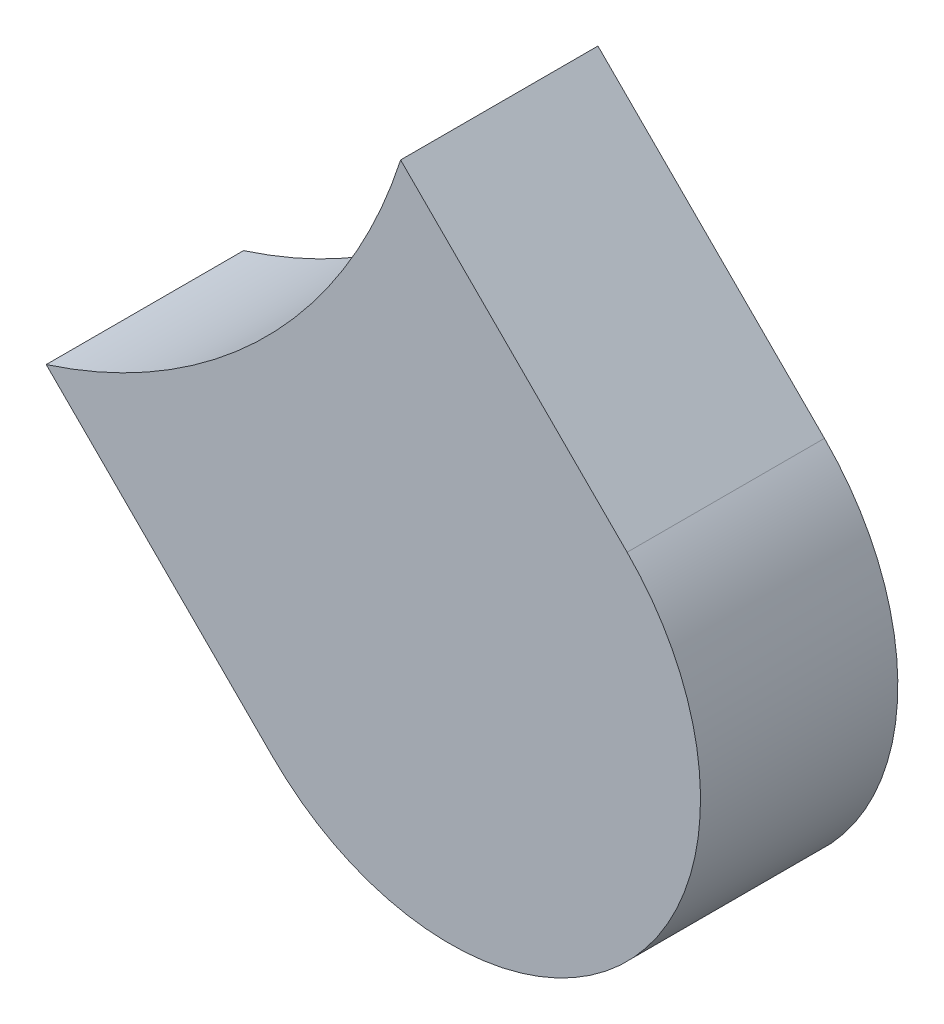
ISO-10303-21;
HEADER;
FILE_DESCRIPTION(('STEP AP214'),'2;1');
FILE_NAME('part.step','',(''),(''),'','','');
FILE_SCHEMA(('AUTOMOTIVE_DESIGN { 1 0 10303 214 1 1 1 1 }'));
ENDSEC;
DATA;
#1=APPLICATION_CONTEXT('core data for automotive mechanical design processes');
#2=APPLICATION_PROTOCOL_DEFINITION('international standard','automotive_design',2000,#1);
#3=PRODUCT_CONTEXT('',#1,'mechanical');
#4=PRODUCT('Part','Part','',(#3));
#5=PRODUCT_RELATED_PRODUCT_CATEGORY('part','',(#4));
#6=PRODUCT_DEFINITION_FORMATION('','',#4);
#7=PRODUCT_DEFINITION_CONTEXT('part definition',#1,'design');
#8=PRODUCT_DEFINITION('design','',#6,#7);
#9=PRODUCT_DEFINITION_SHAPE('','',#8);
#10=(LENGTH_UNIT() NAMED_UNIT(*) SI_UNIT(.MILLI.,.METRE.));
#11=(NAMED_UNIT(*) PLANE_ANGLE_UNIT() SI_UNIT($,.RADIAN.));
#12=(NAMED_UNIT(*) SI_UNIT($,.STERADIAN.) SOLID_ANGLE_UNIT());
#13=UNCERTAINTY_MEASURE_WITH_UNIT(LENGTH_MEASURE(1.E-05),#10,'distance_accuracy_value','');
#14=(GEOMETRIC_REPRESENTATION_CONTEXT(3) GLOBAL_UNCERTAINTY_ASSIGNED_CONTEXT((#13)) GLOBAL_UNIT_ASSIGNED_CONTEXT((#10,
#11,#12)) REPRESENTATION_CONTEXT('',''));
#15=CARTESIAN_POINT('',(0.,0.,0.));
#16=DIRECTION('',(0.,0.,1.));
#17=DIRECTION('',(1.,0.,0.));
#18=AXIS2_PLACEMENT_3D('',#15,#16,#17);
#19=CARTESIAN_POINT('',(149.140329064847,80.2404643951531,0.));
#20=DIRECTION('',(0.707106781186548,0.707106781186548,0.));
#21=DIRECTION('',(0.707106781186548,-0.707106781186548,0.));
#22=AXIS2_PLACEMENT_3D('',#19,#20,#21);
#23=PLANE('',#22);
#24=DIRECTION('',(0.707106781186548,-0.707106781186548,0.));
#25=VECTOR('',#24,1.);
#26=CARTESIAN_POINT('',(148.79139406,80.5893994,0.1999996));
#27=LINE('',#26,#25);
#28=CARTESIAN_POINT('',(149.140329064847,80.2404643951531,0.1999996));
#29=VERTEX_POINT('',#28);
#30=CARTESIAN_POINT('',(149.369907,80.01088646,0.1999996));
#31=VERTEX_POINT('',#30);
#32=EDGE_CURVE('E11',#29,#31,#27,.T.);
#33=ORIENTED_EDGE('',*,*,#32,.F.);
#34=DIRECTION('',(0.,0.,1.));
#35=VECTOR('',#34,1.);
#36=CARTESIAN_POINT('',(149.140329064847,80.2404643951531,0.));
#37=LINE('',#36,#35);
#38=CARTESIAN_POINT('',(149.140329064847,80.2404643951531,0.));
#39=VERTEX_POINT('',#38);
#40=EDGE_CURVE('E24',#39,#29,#37,.T.);
#41=ORIENTED_EDGE('',*,*,#40,.F.);
#42=DIRECTION('',(0.707106781186548,-0.707106781186548,0.));
#43=VECTOR('',#42,1.);
#44=CARTESIAN_POINT('',(148.79139406,80.5893994,0.));
#45=LINE('',#44,#43);
#46=CARTESIAN_POINT('',(149.369907,80.01088646,0.));
#47=VERTEX_POINT('',#46);
#48=EDGE_CURVE('E75',#39,#47,#45,.T.);
#49=ORIENTED_EDGE('',*,*,#48,.T.);
#50=DIRECTION('',(0.,0.,1.));
#51=VECTOR('',#50,1.);
#52=CARTESIAN_POINT('',(149.369907,80.01088646,0.));
#53=LINE('',#52,#51);
#54=EDGE_CURVE('E37',#47,#31,#53,.T.);
#55=ORIENTED_EDGE('',*,*,#54,.T.);
#56=EDGE_LOOP('',(#33,#41,#49,#55));
#57=FACE_BOUND('',#56,.T.);
#58=ADVANCED_FACE('F17',(#57),#23,.F.);
#59=CARTESIAN_POINT('',(149.54951167,80.19049113,0.));
#60=DIRECTION('',(0.,0.,-1.));
#61=DIRECTION('',(-0.707106781186548,-0.707106781186548,0.));
#62=AXIS2_PLACEMENT_3D('',#59,#60,#61);
#63=CYLINDRICAL_SURFACE('',#62,0.253999360179549);
#64=CARTESIAN_POINT('',(149.54951167,80.19049113,0.1999996));
#65=DIRECTION('',(0.,0.,1.));
#66=DIRECTION('',(-0.707106781186548,-0.707106781186548,0.));
#67=AXIS2_PLACEMENT_3D('',#64,#65,#66);
#68=CIRCLE('',#67,0.253999360179549);
#69=CARTESIAN_POINT('',(149.72911634,80.3700958,0.1999996));
#70=VERTEX_POINT('',#69);
#71=EDGE_CURVE('E83',#31,#70,#68,.T.);
#72=ORIENTED_EDGE('',*,*,#71,.F.);
#73=ORIENTED_EDGE('',*,*,#54,.F.);
#74=CARTESIAN_POINT('',(149.54951167,80.19049113,0.));
#75=DIRECTION('',(0.,0.,1.));
#76=DIRECTION('',(-0.707106781186548,-0.707106781186548,0.));
#77=AXIS2_PLACEMENT_3D('',#74,#75,#76);
#78=CIRCLE('',#77,0.253999360179549);
#79=CARTESIAN_POINT('',(149.72911634,80.3700958,0.));
#80=VERTEX_POINT('',#79);
#81=EDGE_CURVE('E81',#47,#80,#78,.T.);
#82=ORIENTED_EDGE('',*,*,#81,.T.);
#83=DIRECTION('',(0.,0.,1.));
#84=VECTOR('',#83,1.);
#85=CARTESIAN_POINT('',(149.72911634,80.3700958,0.));
#86=LINE('',#85,#84);
#87=EDGE_CURVE('E67',#80,#70,#86,.T.);
#88=ORIENTED_EDGE('',*,*,#87,.T.);
#89=EDGE_LOOP('',(#72,#73,#82,#88));
#90=FACE_BOUND('',#89,.T.);
#91=ADVANCED_FACE('F89',(#90),#63,.T.);
#92=CARTESIAN_POINT('',(149.72911634,80.3700958,0.));
#93=DIRECTION('',(-0.707106781186548,-0.707106781186548,0.));
#94=DIRECTION('',(-0.707106781186548,0.707106781186548,0.));
#95=AXIS2_PLACEMENT_3D('',#92,#93,#94);
#96=PLANE('',#95);
#97=DIRECTION('',(-0.707106781186548,0.707106781186548,0.));
#98=VECTOR('',#97,1.);
#99=CARTESIAN_POINT('',(149.72911634,80.3700958,0.1999996));
#100=LINE('',#99,#98);
#101=CARTESIAN_POINT('',(149.499538404847,80.5996737351531,0.1999996));
#102=VERTEX_POINT('',#101);
#103=EDGE_CURVE('E71',#70,#102,#100,.T.);
#104=ORIENTED_EDGE('',*,*,#103,.F.);
#105=ORIENTED_EDGE('',*,*,#87,.F.);
#106=DIRECTION('',(-0.707106781186548,0.707106781186548,0.));
#107=VECTOR('',#106,1.);
#108=CARTESIAN_POINT('',(149.72911634,80.3700958,0.));
#109=LINE('',#108,#107);
#110=CARTESIAN_POINT('',(149.499538404847,80.5996737351531,0.));
#111=VERTEX_POINT('',#110);
#112=EDGE_CURVE('E63',#80,#111,#109,.T.);
#113=ORIENTED_EDGE('',*,*,#112,.T.);
#114=DIRECTION('',(0.,0.,1.));
#115=VECTOR('',#114,1.);
#116=CARTESIAN_POINT('',(149.499538404847,80.5996737351531,0.));
#117=LINE('',#116,#115);
#118=EDGE_CURVE('E53',#111,#102,#117,.T.);
#119=ORIENTED_EDGE('',*,*,#118,.T.);
#120=EDGE_LOOP('',(#104,#105,#113,#119));
#121=FACE_BOUND('',#120,.T.);
#122=ADVANCED_FACE('F66',(#121),#96,.F.);
#123=CARTESIAN_POINT('',(148.971,80.7690028,0.));
#124=DIRECTION('',(0.,0.,-1.));
#125=DIRECTION('',(1.,0.,0.));
#126=AXIS2_PLACEMENT_3D('',#123,#124,#125);
#127=CYLINDRICAL_SURFACE('',#126,0.55500016);
#128=ORIENTED_EDGE('',*,*,#40,.T.);
#129=CARTESIAN_POINT('',(148.971,80.7690028,0.1999996));
#130=DIRECTION('',(0.,0.,1.));
#131=DIRECTION('',(1.,0.,0.));
#132=AXIS2_PLACEMENT_3D('',#129,#130,#131);
#133=CIRCLE('',#132,0.55500016);
#134=EDGE_CURVE('E59',#29,#102,#133,.T.);
#135=ORIENTED_EDGE('',*,*,#134,.T.);
#136=ORIENTED_EDGE('',*,*,#118,.F.);
#137=CARTESIAN_POINT('',(148.971,80.7690028,0.));
#138=DIRECTION('',(0.,0.,1.));
#139=DIRECTION('',(1.,0.,0.));
#140=AXIS2_PLACEMENT_3D('',#137,#138,#139);
#141=CIRCLE('',#140,0.55500016);
#142=EDGE_CURVE('E57',#39,#111,#141,.T.);
#143=ORIENTED_EDGE('',*,*,#142,.F.);
#144=EDGE_LOOP('',(#128,#135,#136,#143));
#145=FACE_BOUND('',#144,.T.);
#146=ADVANCED_FACE('F55',(#145),#127,.F.);
#147=CARTESIAN_POINT('',(148.79139406,80.5893994,0.));
#148=DIRECTION('',(0.,0.,-1.));
#149=DIRECTION('',(-1.,0.,0.));
#150=AXIS2_PLACEMENT_3D('',#147,#148,#149);
#151=PLANE('',#150);
#152=ORIENTED_EDGE('',*,*,#48,.F.);
#153=ORIENTED_EDGE('',*,*,#142,.T.);
#154=ORIENTED_EDGE('',*,*,#112,.F.);
#155=ORIENTED_EDGE('',*,*,#81,.F.);
#156=EDGE_LOOP('',(#152,#153,#154,#155));
#157=FACE_BOUND('',#156,.T.);
#158=ADVANCED_FACE('F74',(#157),#151,.T.);
#159=CARTESIAN_POINT('',(148.79139406,80.5893994,0.1999996));
#160=DIRECTION('',(0.,0.,-1.));
#161=DIRECTION('',(-1.,0.,0.));
#162=AXIS2_PLACEMENT_3D('',#159,#160,#161);
#163=PLANE('',#162);
#164=ORIENTED_EDGE('',*,*,#134,.F.);
#165=ORIENTED_EDGE('',*,*,#32,.T.);
#166=ORIENTED_EDGE('',*,*,#71,.T.);
#167=ORIENTED_EDGE('',*,*,#103,.T.);
#168=EDGE_LOOP('',(#164,#165,#166,#167));
#169=FACE_BOUND('',#168,.T.);
#170=ADVANCED_FACE('F91',(#169),#163,.F.);
#171=CLOSED_SHELL('',(#58,#91,#122,#146,#158,#170));
#172=MANIFOLD_SOLID_BREP('B1',#171);
#173=ADVANCED_BREP_SHAPE_REPRESENTATION('',(#18,#172),#14);
#174=SHAPE_DEFINITION_REPRESENTATION(#9,#173);
ENDSEC;
END-ISO-10303-21;
